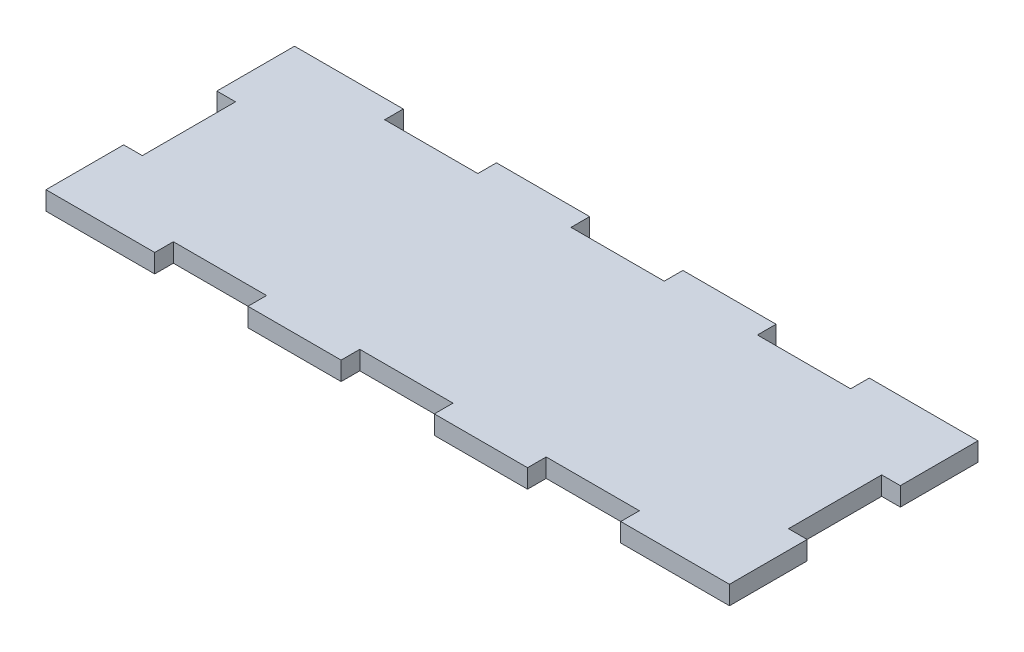
ISO-10303-21;
HEADER;
FILE_DESCRIPTION(('STEP AP214'),'2;1');
FILE_NAME('part.step','',(''),(''),'','','');
FILE_SCHEMA(('AUTOMOTIVE_DESIGN { 1 0 10303 214 1 1 1 1 }'));
ENDSEC;
DATA;
#1=APPLICATION_CONTEXT('core data for automotive mechanical design processes');
#2=APPLICATION_PROTOCOL_DEFINITION('international standard','automotive_design',2000,#1);
#3=PRODUCT_CONTEXT('',#1,'mechanical');
#4=PRODUCT('Part','Part','',(#3));
#5=PRODUCT_RELATED_PRODUCT_CATEGORY('part','',(#4));
#6=PRODUCT_DEFINITION_FORMATION('','',#4);
#7=PRODUCT_DEFINITION_CONTEXT('part definition',#1,'design');
#8=PRODUCT_DEFINITION('design','',#6,#7);
#9=PRODUCT_DEFINITION_SHAPE('','',#8);
#10=(LENGTH_UNIT() NAMED_UNIT(*) SI_UNIT(.MILLI.,.METRE.));
#11=(NAMED_UNIT(*) PLANE_ANGLE_UNIT() SI_UNIT($,.RADIAN.));
#12=(NAMED_UNIT(*) SI_UNIT($,.STERADIAN.) SOLID_ANGLE_UNIT());
#13=UNCERTAINTY_MEASURE_WITH_UNIT(LENGTH_MEASURE(1.E-05),#10,'distance_accuracy_value','');
#14=(GEOMETRIC_REPRESENTATION_CONTEXT(3) GLOBAL_UNCERTAINTY_ASSIGNED_CONTEXT((#13)) GLOBAL_UNIT_ASSIGNED_CONTEXT((#10,
#11,#12)) REPRESENTATION_CONTEXT('',''));
#15=CARTESIAN_POINT('',(0.,0.,0.));
#16=DIRECTION('',(0.,0.,1.));
#17=DIRECTION('',(1.,0.,0.));
#18=AXIS2_PLACEMENT_3D('',#15,#16,#17);
#19=CARTESIAN_POINT('',(3.,3.,0.));
#20=DIRECTION('',(-1.,0.,0.));
#21=DIRECTION('',(0.,0.,1.));
#22=AXIS2_PLACEMENT_3D('',#19,#20,#21);
#23=PLANE('',#22);
#24=DIRECTION('',(0.,0.,-1.));
#25=VECTOR('',#24,1.);
#26=CARTESIAN_POINT('',(3.,0.,0.));
#27=LINE('',#26,#25);
#28=CARTESIAN_POINT('',(3.,0.,-12.5));
#29=VERTEX_POINT('',#28);
#30=CARTESIAN_POINT('',(3.,0.,-27.5));
#31=VERTEX_POINT('',#30);
#32=EDGE_CURVE('E295',#29,#31,#27,.T.);
#33=ORIENTED_EDGE('',*,*,#32,.F.);
#34=DIRECTION('',(0.,-1.,0.));
#35=VECTOR('',#34,1.);
#36=CARTESIAN_POINT('',(3.,3.,-12.5));
#37=LINE('',#36,#35);
#38=CARTESIAN_POINT('',(3.,3.,-12.5));
#39=VERTEX_POINT('',#38);
#40=EDGE_CURVE('E11',#39,#29,#37,.T.);
#41=ORIENTED_EDGE('',*,*,#40,.F.);
#42=DIRECTION('',(0.,0.,-1.));
#43=VECTOR('',#42,1.);
#44=CARTESIAN_POINT('',(3.,3.,0.));
#45=LINE('',#44,#43);
#46=CARTESIAN_POINT('',(3.,3.,-27.5));
#47=VERTEX_POINT('',#46);
#48=EDGE_CURVE('E382',#39,#47,#45,.T.);
#49=ORIENTED_EDGE('',*,*,#48,.T.);
#50=DIRECTION('',(0.,-1.,0.));
#51=VECTOR('',#50,1.);
#52=CARTESIAN_POINT('',(3.,3.,-27.5));
#53=LINE('',#52,#51);
#54=EDGE_CURVE('E49',#47,#31,#53,.T.);
#55=ORIENTED_EDGE('',*,*,#54,.T.);
#56=EDGE_LOOP('',(#33,#41,#49,#55));
#57=FACE_BOUND('',#56,.T.);
#58=ADVANCED_FACE('F33',(#57),#23,.T.);
#59=CARTESIAN_POINT('',(0.,3.,-12.5));
#60=DIRECTION('',(0.,0.,1.));
#61=DIRECTION('',(1.,0.,0.));
#62=AXIS2_PLACEMENT_3D('',#59,#60,#61);
#63=PLANE('',#62);
#64=DIRECTION('',(-1.,0.,0.));
#65=VECTOR('',#64,1.);
#66=CARTESIAN_POINT('',(0.,0.,-12.5));
#67=LINE('',#66,#65);
#68=CARTESIAN_POINT('',(0.,0.,-12.5));
#69=VERTEX_POINT('',#68);
#70=EDGE_CURVE('E297',#29,#69,#67,.T.);
#71=ORIENTED_EDGE('',*,*,#70,.T.);
#72=DIRECTION('',(0.,-1.,0.));
#73=VECTOR('',#72,1.);
#74=CARTESIAN_POINT('',(0.,3.,-12.5));
#75=LINE('',#74,#73);
#76=CARTESIAN_POINT('',(0.,3.,-12.5));
#77=VERTEX_POINT('',#76);
#78=EDGE_CURVE('E41',#77,#69,#75,.T.);
#79=ORIENTED_EDGE('',*,*,#78,.F.);
#80=DIRECTION('',(-1.,0.,0.));
#81=VECTOR('',#80,1.);
#82=CARTESIAN_POINT('',(0.,3.,-12.5));
#83=LINE('',#82,#81);
#84=EDGE_CURVE('E485',#39,#77,#83,.T.);
#85=ORIENTED_EDGE('',*,*,#84,.F.);
#86=ORIENTED_EDGE('',*,*,#40,.T.);
#87=EDGE_LOOP('',(#71,#79,#85,#86));
#88=FACE_BOUND('',#87,.T.);
#89=ADVANCED_FACE('F571',(#88),#63,.F.);
#90=CARTESIAN_POINT('',(0.,3.,0.));
#91=DIRECTION('',(1.,0.,0.));
#92=DIRECTION('',(0.,0.,-1.));
#93=AXIS2_PLACEMENT_3D('',#90,#91,#92);
#94=PLANE('',#93);
#95=DIRECTION('',(0.,0.,1.));
#96=VECTOR('',#95,1.);
#97=CARTESIAN_POINT('',(0.,0.,0.));
#98=LINE('',#97,#96);
#99=CARTESIAN_POINT('',(0.,0.,0.));
#100=VERTEX_POINT('',#99);
#101=EDGE_CURVE('E299',#69,#100,#98,.T.);
#102=ORIENTED_EDGE('',*,*,#101,.T.);
#103=DIRECTION('',(0.,-1.,0.));
#104=VECTOR('',#103,1.);
#105=CARTESIAN_POINT('',(0.,3.,0.));
#106=LINE('',#105,#104);
#107=CARTESIAN_POINT('',(0.,3.,0.));
#108=VERTEX_POINT('',#107);
#109=EDGE_CURVE('E458',#108,#100,#106,.T.);
#110=ORIENTED_EDGE('',*,*,#109,.F.);
#111=DIRECTION('',(0.,0.,1.));
#112=VECTOR('',#111,1.);
#113=CARTESIAN_POINT('',(0.,3.,0.));
#114=LINE('',#113,#112);
#115=EDGE_CURVE('E467',#77,#108,#114,.T.);
#116=ORIENTED_EDGE('',*,*,#115,.F.);
#117=ORIENTED_EDGE('',*,*,#78,.T.);
#118=EDGE_LOOP('',(#102,#110,#116,#117));
#119=FACE_BOUND('',#118,.T.);
#120=ADVANCED_FACE('F465',(#119),#94,.F.);
#121=CARTESIAN_POINT('',(0.,3.,0.));
#122=DIRECTION('',(0.,0.,-1.));
#123=DIRECTION('',(-1.,0.,0.));
#124=AXIS2_PLACEMENT_3D('',#121,#122,#123);
#125=PLANE('',#124);
#126=DIRECTION('',(1.,0.,0.));
#127=VECTOR('',#126,1.);
#128=CARTESIAN_POINT('',(0.,0.,0.));
#129=LINE('',#128,#127);
#130=CARTESIAN_POINT('',(17.5,0.,0.));
#131=VERTEX_POINT('',#130);
#132=EDGE_CURVE('E301',#100,#131,#129,.T.);
#133=ORIENTED_EDGE('',*,*,#132,.T.);
#134=DIRECTION('',(0.,-1.,0.));
#135=VECTOR('',#134,1.);
#136=CARTESIAN_POINT('',(17.5,3.,0.));
#137=LINE('',#136,#135);
#138=CARTESIAN_POINT('',(17.5,3.,0.));
#139=VERTEX_POINT('',#138);
#140=EDGE_CURVE('E456',#139,#131,#137,.T.);
#141=ORIENTED_EDGE('',*,*,#140,.F.);
#142=DIRECTION('',(1.,0.,0.));
#143=VECTOR('',#142,1.);
#144=CARTESIAN_POINT('',(0.,3.,0.));
#145=LINE('',#144,#143);
#146=EDGE_CURVE('E479',#108,#139,#145,.T.);
#147=ORIENTED_EDGE('',*,*,#146,.F.);
#148=ORIENTED_EDGE('',*,*,#109,.T.);
#149=EDGE_LOOP('',(#133,#141,#147,#148));
#150=FACE_BOUND('',#149,.T.);
#151=ADVANCED_FACE('F476',(#150),#125,.F.);
#152=CARTESIAN_POINT('',(17.5,3.,0.));
#153=DIRECTION('',(1.,0.,0.));
#154=DIRECTION('',(0.,0.,-1.));
#155=AXIS2_PLACEMENT_3D('',#152,#153,#154);
#156=PLANE('',#155);
#157=DIRECTION('',(0.,0.,1.));
#158=VECTOR('',#157,1.);
#159=CARTESIAN_POINT('',(17.5,0.,0.));
#160=LINE('',#159,#158);
#161=CARTESIAN_POINT('',(17.5,0.,-3.));
#162=VERTEX_POINT('',#161);
#163=EDGE_CURVE('E304',#162,#131,#160,.T.);
#164=ORIENTED_EDGE('',*,*,#163,.F.);
#165=DIRECTION('',(0.,-1.,0.));
#166=VECTOR('',#165,1.);
#167=CARTESIAN_POINT('',(17.5,3.,-3.));
#168=LINE('',#167,#166);
#169=CARTESIAN_POINT('',(17.5,3.,-3.));
#170=VERTEX_POINT('',#169);
#171=EDGE_CURVE('E454',#170,#162,#168,.T.);
#172=ORIENTED_EDGE('',*,*,#171,.F.);
#173=DIRECTION('',(0.,0.,1.));
#174=VECTOR('',#173,1.);
#175=CARTESIAN_POINT('',(17.5,3.,0.));
#176=LINE('',#175,#174);
#177=EDGE_CURVE('E481',#170,#139,#176,.T.);
#178=ORIENTED_EDGE('',*,*,#177,.T.);
#179=ORIENTED_EDGE('',*,*,#140,.T.);
#180=EDGE_LOOP('',(#164,#172,#178,#179));
#181=FACE_BOUND('',#180,.T.);
#182=ADVANCED_FACE('F582',(#181),#156,.T.);
#183=CARTESIAN_POINT('',(0.,3.,-3.));
#184=DIRECTION('',(0.,0.,1.));
#185=DIRECTION('',(1.,0.,0.));
#186=AXIS2_PLACEMENT_3D('',#183,#184,#185);
#187=PLANE('',#186);
#188=DIRECTION('',(-1.,0.,0.));
#189=VECTOR('',#188,1.);
#190=CARTESIAN_POINT('',(0.,0.,-3.));
#191=LINE('',#190,#189);
#192=CARTESIAN_POINT('',(32.5,0.,-3.));
#193=VERTEX_POINT('',#192);
#194=EDGE_CURVE('E307',#193,#162,#191,.T.);
#195=ORIENTED_EDGE('',*,*,#194,.F.);
#196=DIRECTION('',(0.,-1.,0.));
#197=VECTOR('',#196,1.);
#198=CARTESIAN_POINT('',(32.5,3.,-3.));
#199=LINE('',#198,#197);
#200=CARTESIAN_POINT('',(32.5,3.,-3.));
#201=VERTEX_POINT('',#200);
#202=EDGE_CURVE('E452',#201,#193,#199,.T.);
#203=ORIENTED_EDGE('',*,*,#202,.F.);
#204=DIRECTION('',(-1.,0.,0.));
#205=VECTOR('',#204,1.);
#206=CARTESIAN_POINT('',(0.,3.,-3.));
#207=LINE('',#206,#205);
#208=EDGE_CURVE('E483',#201,#170,#207,.T.);
#209=ORIENTED_EDGE('',*,*,#208,.T.);
#210=ORIENTED_EDGE('',*,*,#171,.T.);
#211=EDGE_LOOP('',(#195,#203,#209,#210));
#212=FACE_BOUND('',#211,.T.);
#213=ADVANCED_FACE('F585',(#212),#187,.T.);
#214=CARTESIAN_POINT('',(32.5,3.,0.));
#215=DIRECTION('',(-1.,0.,0.));
#216=DIRECTION('',(0.,0.,1.));
#217=AXIS2_PLACEMENT_3D('',#214,#215,#216);
#218=PLANE('',#217);
#219=DIRECTION('',(0.,0.,-1.));
#220=VECTOR('',#219,1.);
#221=CARTESIAN_POINT('',(32.5,0.,0.));
#222=LINE('',#221,#220);
#223=CARTESIAN_POINT('',(32.5,0.,0.));
#224=VERTEX_POINT('',#223);
#225=EDGE_CURVE('E310',#224,#193,#222,.T.);
#226=ORIENTED_EDGE('',*,*,#225,.F.);
#227=DIRECTION('',(0.,-1.,0.));
#228=VECTOR('',#227,1.);
#229=CARTESIAN_POINT('',(32.5,3.,0.));
#230=LINE('',#229,#228);
#231=CARTESIAN_POINT('',(32.5,3.,0.));
#232=VERTEX_POINT('',#231);
#233=EDGE_CURVE('E450',#232,#224,#230,.T.);
#234=ORIENTED_EDGE('',*,*,#233,.F.);
#235=DIRECTION('',(0.,0.,-1.));
#236=VECTOR('',#235,1.);
#237=CARTESIAN_POINT('',(32.5,3.,0.));
#238=LINE('',#237,#236);
#239=EDGE_CURVE('E491',#232,#201,#238,.T.);
#240=ORIENTED_EDGE('',*,*,#239,.T.);
#241=ORIENTED_EDGE('',*,*,#202,.T.);
#242=EDGE_LOOP('',(#226,#234,#240,#241));
#243=FACE_BOUND('',#242,.T.);
#244=ADVANCED_FACE('F589',(#243),#218,.T.);
#245=CARTESIAN_POINT('',(0.,3.,0.));
#246=DIRECTION('',(0.,0.,-1.));
#247=DIRECTION('',(-1.,0.,0.));
#248=AXIS2_PLACEMENT_3D('',#245,#246,#247);
#249=PLANE('',#248);
#250=DIRECTION('',(1.,0.,0.));
#251=VECTOR('',#250,1.);
#252=CARTESIAN_POINT('',(0.,0.,0.));
#253=LINE('',#252,#251);
#254=CARTESIAN_POINT('',(47.5,0.,0.));
#255=VERTEX_POINT('',#254);
#256=EDGE_CURVE('E313',#224,#255,#253,.T.);
#257=ORIENTED_EDGE('',*,*,#256,.T.);
#258=DIRECTION('',(0.,-1.,0.));
#259=VECTOR('',#258,1.);
#260=CARTESIAN_POINT('',(47.5,3.,0.));
#261=LINE('',#260,#259);
#262=CARTESIAN_POINT('',(47.5,3.,0.));
#263=VERTEX_POINT('',#262);
#264=EDGE_CURVE('E448',#263,#255,#261,.T.);
#265=ORIENTED_EDGE('',*,*,#264,.F.);
#266=DIRECTION('',(1.,0.,0.));
#267=VECTOR('',#266,1.);
#268=CARTESIAN_POINT('',(0.,3.,0.));
#269=LINE('',#268,#267);
#270=EDGE_CURVE('E494',#232,#263,#269,.T.);
#271=ORIENTED_EDGE('',*,*,#270,.F.);
#272=ORIENTED_EDGE('',*,*,#233,.T.);
#273=EDGE_LOOP('',(#257,#265,#271,#272));
#274=FACE_BOUND('',#273,.T.);
#275=ADVANCED_FACE('F593',(#274),#249,.F.);
#276=CARTESIAN_POINT('',(47.5,3.,0.));
#277=DIRECTION('',(1.,0.,0.));
#278=DIRECTION('',(0.,0.,-1.));
#279=AXIS2_PLACEMENT_3D('',#276,#277,#278);
#280=PLANE('',#279);
#281=DIRECTION('',(0.,0.,1.));
#282=VECTOR('',#281,1.);
#283=CARTESIAN_POINT('',(47.5,0.,0.));
#284=LINE('',#283,#282);
#285=CARTESIAN_POINT('',(47.5,0.,-3.));
#286=VERTEX_POINT('',#285);
#287=EDGE_CURVE('E316',#286,#255,#284,.T.);
#288=ORIENTED_EDGE('',*,*,#287,.F.);
#289=DIRECTION('',(0.,-1.,0.));
#290=VECTOR('',#289,1.);
#291=CARTESIAN_POINT('',(47.5,3.,-3.));
#292=LINE('',#291,#290);
#293=CARTESIAN_POINT('',(47.5,3.,-3.));
#294=VERTEX_POINT('',#293);
#295=EDGE_CURVE('E446',#294,#286,#292,.T.);
#296=ORIENTED_EDGE('',*,*,#295,.F.);
#297=DIRECTION('',(0.,0.,1.));
#298=VECTOR('',#297,1.);
#299=CARTESIAN_POINT('',(47.5,3.,0.));
#300=LINE('',#299,#298);
#301=EDGE_CURVE('E496',#294,#263,#300,.T.);
#302=ORIENTED_EDGE('',*,*,#301,.T.);
#303=ORIENTED_EDGE('',*,*,#264,.T.);
#304=EDGE_LOOP('',(#288,#296,#302,#303));
#305=FACE_BOUND('',#304,.T.);
#306=ADVANCED_FACE('F597',(#305),#280,.T.);
#307=CARTESIAN_POINT('',(0.,3.,-3.));
#308=DIRECTION('',(0.,0.,-1.));
#309=DIRECTION('',(-1.,0.,0.));
#310=AXIS2_PLACEMENT_3D('',#307,#308,#309);
#311=PLANE('',#310);
#312=DIRECTION('',(1.,0.,0.));
#313=VECTOR('',#312,1.);
#314=CARTESIAN_POINT('',(0.,0.,-3.));
#315=LINE('',#314,#313);
#316=CARTESIAN_POINT('',(62.5,0.,-3.));
#317=VERTEX_POINT('',#316);
#318=EDGE_CURVE('E319',#286,#317,#315,.T.);
#319=ORIENTED_EDGE('',*,*,#318,.T.);
#320=DIRECTION('',(0.,-1.,0.));
#321=VECTOR('',#320,1.);
#322=CARTESIAN_POINT('',(62.5,3.,-3.));
#323=LINE('',#322,#321);
#324=CARTESIAN_POINT('',(62.5,3.,-3.));
#325=VERTEX_POINT('',#324);
#326=EDGE_CURVE('E443',#325,#317,#323,.T.);
#327=ORIENTED_EDGE('',*,*,#326,.F.);
#328=DIRECTION('',(1.,0.,0.));
#329=VECTOR('',#328,1.);
#330=CARTESIAN_POINT('',(0.,3.,-3.));
#331=LINE('',#330,#329);
#332=EDGE_CURVE('E499',#294,#325,#331,.T.);
#333=ORIENTED_EDGE('',*,*,#332,.F.);
#334=ORIENTED_EDGE('',*,*,#295,.T.);
#335=EDGE_LOOP('',(#319,#327,#333,#334));
#336=FACE_BOUND('',#335,.T.);
#337=ADVANCED_FACE('F601',(#336),#311,.F.);
#338=CARTESIAN_POINT('',(62.5,3.,0.));
#339=DIRECTION('',(1.,0.,0.));
#340=DIRECTION('',(0.,0.,-1.));
#341=AXIS2_PLACEMENT_3D('',#338,#339,#340);
#342=PLANE('',#341);
#343=DIRECTION('',(0.,0.,1.));
#344=VECTOR('',#343,1.);
#345=CARTESIAN_POINT('',(62.5,0.,0.));
#346=LINE('',#345,#344);
#347=CARTESIAN_POINT('',(62.5,0.,0.));
#348=VERTEX_POINT('',#347);
#349=EDGE_CURVE('E321',#317,#348,#346,.T.);
#350=ORIENTED_EDGE('',*,*,#349,.T.);
#351=DIRECTION('',(0.,-1.,0.));
#352=VECTOR('',#351,1.);
#353=CARTESIAN_POINT('',(62.5,3.,0.));
#354=LINE('',#353,#352);
#355=CARTESIAN_POINT('',(62.5,3.,0.));
#356=VERTEX_POINT('',#355);
#357=EDGE_CURVE('E440',#356,#348,#354,.T.);
#358=ORIENTED_EDGE('',*,*,#357,.F.);
#359=DIRECTION('',(0.,0.,1.));
#360=VECTOR('',#359,1.);
#361=CARTESIAN_POINT('',(62.5,3.,0.));
#362=LINE('',#361,#360);
#363=EDGE_CURVE('E501',#325,#356,#362,.T.);
#364=ORIENTED_EDGE('',*,*,#363,.F.);
#365=ORIENTED_EDGE('',*,*,#326,.T.);
#366=EDGE_LOOP('',(#350,#358,#364,#365));
#367=FACE_BOUND('',#366,.T.);
#368=ADVANCED_FACE('F605',(#367),#342,.F.);
#369=CARTESIAN_POINT('',(0.,3.,0.));
#370=DIRECTION('',(0.,0.,-1.));
#371=DIRECTION('',(-1.,0.,0.));
#372=AXIS2_PLACEMENT_3D('',#369,#370,#371);
#373=PLANE('',#372);
#374=DIRECTION('',(1.,0.,0.));
#375=VECTOR('',#374,1.);
#376=CARTESIAN_POINT('',(0.,0.,0.));
#377=LINE('',#376,#375);
#378=CARTESIAN_POINT('',(77.5,0.,0.));
#379=VERTEX_POINT('',#378);
#380=EDGE_CURVE('E323',#348,#379,#377,.T.);
#381=ORIENTED_EDGE('',*,*,#380,.T.);
#382=DIRECTION('',(0.,-1.,0.));
#383=VECTOR('',#382,1.);
#384=CARTESIAN_POINT('',(77.5,3.,0.));
#385=LINE('',#384,#383);
#386=CARTESIAN_POINT('',(77.5,3.,0.));
#387=VERTEX_POINT('',#386);
#388=EDGE_CURVE('E437',#387,#379,#385,.T.);
#389=ORIENTED_EDGE('',*,*,#388,.F.);
#390=DIRECTION('',(1.,0.,0.));
#391=VECTOR('',#390,1.);
#392=CARTESIAN_POINT('',(0.,3.,0.));
#393=LINE('',#392,#391);
#394=EDGE_CURVE('E503',#356,#387,#393,.T.);
#395=ORIENTED_EDGE('',*,*,#394,.F.);
#396=ORIENTED_EDGE('',*,*,#357,.T.);
#397=EDGE_LOOP('',(#381,#389,#395,#396));
#398=FACE_BOUND('',#397,.T.);
#399=ADVANCED_FACE('F609',(#398),#373,.F.);
#400=CARTESIAN_POINT('',(77.5,3.,0.));
#401=DIRECTION('',(-1.,0.,0.));
#402=DIRECTION('',(0.,0.,1.));
#403=AXIS2_PLACEMENT_3D('',#400,#401,#402);
#404=PLANE('',#403);
#405=DIRECTION('',(0.,0.,-1.));
#406=VECTOR('',#405,1.);
#407=CARTESIAN_POINT('',(77.5,0.,0.));
#408=LINE('',#407,#406);
#409=CARTESIAN_POINT('',(77.5,0.,-3.));
#410=VERTEX_POINT('',#409);
#411=EDGE_CURVE('E325',#379,#410,#408,.T.);
#412=ORIENTED_EDGE('',*,*,#411,.T.);
#413=DIRECTION('',(0.,-1.,0.));
#414=VECTOR('',#413,1.);
#415=CARTESIAN_POINT('',(77.5,3.,-3.));
#416=LINE('',#415,#414);
#417=CARTESIAN_POINT('',(77.5,3.,-3.));
#418=VERTEX_POINT('',#417);
#419=EDGE_CURVE('E434',#418,#410,#416,.T.);
#420=ORIENTED_EDGE('',*,*,#419,.F.);
#421=DIRECTION('',(0.,0.,-1.));
#422=VECTOR('',#421,1.);
#423=CARTESIAN_POINT('',(77.5,3.,0.));
#424=LINE('',#423,#422);
#425=EDGE_CURVE('E505',#387,#418,#424,.T.);
#426=ORIENTED_EDGE('',*,*,#425,.F.);
#427=ORIENTED_EDGE('',*,*,#388,.T.);
#428=EDGE_LOOP('',(#412,#420,#426,#427));
#429=FACE_BOUND('',#428,.T.);
#430=ADVANCED_FACE('F613',(#429),#404,.F.);
#431=CARTESIAN_POINT('',(0.,3.,-3.));
#432=DIRECTION('',(0.,0.,-1.));
#433=DIRECTION('',(-1.,0.,0.));
#434=AXIS2_PLACEMENT_3D('',#431,#432,#433);
#435=PLANE('',#434);
#436=DIRECTION('',(1.,0.,0.));
#437=VECTOR('',#436,1.);
#438=CARTESIAN_POINT('',(0.,0.,-3.));
#439=LINE('',#438,#437);
#440=CARTESIAN_POINT('',(92.5,0.,-3.));
#441=VERTEX_POINT('',#440);
#442=EDGE_CURVE('E327',#410,#441,#439,.T.);
#443=ORIENTED_EDGE('',*,*,#442,.T.);
#444=DIRECTION('',(0.,-1.,0.));
#445=VECTOR('',#444,1.);
#446=CARTESIAN_POINT('',(92.5,3.,-3.));
#447=LINE('',#446,#445);
#448=CARTESIAN_POINT('',(92.5,3.,-3.));
#449=VERTEX_POINT('',#448);
#450=EDGE_CURVE('E431',#449,#441,#447,.T.);
#451=ORIENTED_EDGE('',*,*,#450,.F.);
#452=DIRECTION('',(1.,0.,0.));
#453=VECTOR('',#452,1.);
#454=CARTESIAN_POINT('',(0.,3.,-3.));
#455=LINE('',#454,#453);
#456=EDGE_CURVE('E507',#418,#449,#455,.T.);
#457=ORIENTED_EDGE('',*,*,#456,.F.);
#458=ORIENTED_EDGE('',*,*,#419,.T.);
#459=EDGE_LOOP('',(#443,#451,#457,#458));
#460=FACE_BOUND('',#459,.T.);
#461=ADVANCED_FACE('F617',(#460),#435,.F.);
#462=CARTESIAN_POINT('',(92.5,3.,0.));
#463=DIRECTION('',(1.,0.,0.));
#464=DIRECTION('',(0.,0.,-1.));
#465=AXIS2_PLACEMENT_3D('',#462,#463,#464);
#466=PLANE('',#465);
#467=DIRECTION('',(0.,0.,1.));
#468=VECTOR('',#467,1.);
#469=CARTESIAN_POINT('',(92.5,0.,0.));
#470=LINE('',#469,#468);
#471=CARTESIAN_POINT('',(92.5,0.,0.));
#472=VERTEX_POINT('',#471);
#473=EDGE_CURVE('E329',#441,#472,#470,.T.);
#474=ORIENTED_EDGE('',*,*,#473,.T.);
#475=DIRECTION('',(0.,-1.,0.));
#476=VECTOR('',#475,1.);
#477=CARTESIAN_POINT('',(92.5,3.,0.));
#478=LINE('',#477,#476);
#479=CARTESIAN_POINT('',(92.5,3.,0.));
#480=VERTEX_POINT('',#479);
#481=EDGE_CURVE('E428',#480,#472,#478,.T.);
#482=ORIENTED_EDGE('',*,*,#481,.F.);
#483=DIRECTION('',(0.,0.,1.));
#484=VECTOR('',#483,1.);
#485=CARTESIAN_POINT('',(92.5,3.,0.));
#486=LINE('',#485,#484);
#487=EDGE_CURVE('E509',#449,#480,#486,.T.);
#488=ORIENTED_EDGE('',*,*,#487,.F.);
#489=ORIENTED_EDGE('',*,*,#450,.T.);
#490=EDGE_LOOP('',(#474,#482,#488,#489));
#491=FACE_BOUND('',#490,.T.);
#492=ADVANCED_FACE('F621',(#491),#466,.F.);
#493=CARTESIAN_POINT('',(0.,3.,0.));
#494=DIRECTION('',(0.,0.,-1.));
#495=DIRECTION('',(-1.,0.,0.));
#496=AXIS2_PLACEMENT_3D('',#493,#494,#495);
#497=PLANE('',#496);
#498=DIRECTION('',(1.,0.,0.));
#499=VECTOR('',#498,1.);
#500=CARTESIAN_POINT('',(0.,0.,0.));
#501=LINE('',#500,#499);
#502=CARTESIAN_POINT('',(110.,0.,0.));
#503=VERTEX_POINT('',#502);
#504=EDGE_CURVE('E331',#472,#503,#501,.T.);
#505=ORIENTED_EDGE('',*,*,#504,.T.);
#506=DIRECTION('',(0.,-1.,0.));
#507=VECTOR('',#506,1.);
#508=CARTESIAN_POINT('',(110.,3.,0.));
#509=LINE('',#508,#507);
#510=CARTESIAN_POINT('',(110.,3.,0.));
#511=VERTEX_POINT('',#510);
#512=EDGE_CURVE('E425',#511,#503,#509,.T.);
#513=ORIENTED_EDGE('',*,*,#512,.F.);
#514=DIRECTION('',(1.,0.,0.));
#515=VECTOR('',#514,1.);
#516=CARTESIAN_POINT('',(0.,3.,0.));
#517=LINE('',#516,#515);
#518=EDGE_CURVE('E511',#480,#511,#517,.T.);
#519=ORIENTED_EDGE('',*,*,#518,.F.);
#520=ORIENTED_EDGE('',*,*,#481,.T.);
#521=EDGE_LOOP('',(#505,#513,#519,#520));
#522=FACE_BOUND('',#521,.T.);
#523=ADVANCED_FACE('F625',(#522),#497,.F.);
#524=CARTESIAN_POINT('',(110.,3.,0.));
#525=DIRECTION('',(-1.,0.,0.));
#526=DIRECTION('',(0.,0.,1.));
#527=AXIS2_PLACEMENT_3D('',#524,#525,#526);
#528=PLANE('',#527);
#529=DIRECTION('',(0.,0.,-1.));
#530=VECTOR('',#529,1.);
#531=CARTESIAN_POINT('',(110.,0.,0.));
#532=LINE('',#531,#530);
#533=CARTESIAN_POINT('',(110.,0.,-12.5));
#534=VERTEX_POINT('',#533);
#535=EDGE_CURVE('E333',#503,#534,#532,.T.);
#536=ORIENTED_EDGE('',*,*,#535,.T.);
#537=DIRECTION('',(0.,-1.,0.));
#538=VECTOR('',#537,1.);
#539=CARTESIAN_POINT('',(110.,3.,-12.5));
#540=LINE('',#539,#538);
#541=CARTESIAN_POINT('',(110.,3.,-12.5));
#542=VERTEX_POINT('',#541);
#543=EDGE_CURVE('E423',#542,#534,#540,.T.);
#544=ORIENTED_EDGE('',*,*,#543,.F.);
#545=DIRECTION('',(0.,0.,-1.));
#546=VECTOR('',#545,1.);
#547=CARTESIAN_POINT('',(110.,3.,0.));
#548=LINE('',#547,#546);
#549=EDGE_CURVE('E513',#511,#542,#548,.T.);
#550=ORIENTED_EDGE('',*,*,#549,.F.);
#551=ORIENTED_EDGE('',*,*,#512,.T.);
#552=EDGE_LOOP('',(#536,#544,#550,#551));
#553=FACE_BOUND('',#552,.T.);
#554=ADVANCED_FACE('F629',(#553),#528,.F.);
#555=CARTESIAN_POINT('',(0.,3.,-12.5));
#556=DIRECTION('',(0.,0.,-1.));
#557=DIRECTION('',(-1.,0.,0.));
#558=AXIS2_PLACEMENT_3D('',#555,#556,#557);
#559=PLANE('',#558);
#560=DIRECTION('',(1.,0.,0.));
#561=VECTOR('',#560,1.);
#562=CARTESIAN_POINT('',(0.,0.,-12.5));
#563=LINE('',#562,#561);
#564=CARTESIAN_POINT('',(107.,0.,-12.5));
#565=VERTEX_POINT('',#564);
#566=EDGE_CURVE('E336',#565,#534,#563,.T.);
#567=ORIENTED_EDGE('',*,*,#566,.F.);
#568=DIRECTION('',(0.,-1.,0.));
#569=VECTOR('',#568,1.);
#570=CARTESIAN_POINT('',(107.,3.,-12.5));
#571=LINE('',#570,#569);
#572=CARTESIAN_POINT('',(107.,3.,-12.5));
#573=VERTEX_POINT('',#572);
#574=EDGE_CURVE('E421',#573,#565,#571,.T.);
#575=ORIENTED_EDGE('',*,*,#574,.F.);
#576=DIRECTION('',(1.,0.,0.));
#577=VECTOR('',#576,1.);
#578=CARTESIAN_POINT('',(0.,3.,-12.5));
#579=LINE('',#578,#577);
#580=EDGE_CURVE('E515',#573,#542,#579,.T.);
#581=ORIENTED_EDGE('',*,*,#580,.T.);
#582=ORIENTED_EDGE('',*,*,#543,.T.);
#583=EDGE_LOOP('',(#567,#575,#581,#582));
#584=FACE_BOUND('',#583,.T.);
#585=ADVANCED_FACE('F633',(#584),#559,.T.);
#586=CARTESIAN_POINT('',(107.,3.,0.));
#587=DIRECTION('',(-1.,0.,0.));
#588=DIRECTION('',(0.,0.,1.));
#589=AXIS2_PLACEMENT_3D('',#586,#587,#588);
#590=PLANE('',#589);
#591=DIRECTION('',(0.,0.,-1.));
#592=VECTOR('',#591,1.);
#593=CARTESIAN_POINT('',(107.,0.,0.));
#594=LINE('',#593,#592);
#595=CARTESIAN_POINT('',(107.,0.,-27.5));
#596=VERTEX_POINT('',#595);
#597=EDGE_CURVE('E339',#565,#596,#594,.T.);
#598=ORIENTED_EDGE('',*,*,#597,.T.);
#599=DIRECTION('',(0.,-1.,0.));
#600=VECTOR('',#599,1.);
#601=CARTESIAN_POINT('',(107.,3.,-27.5));
#602=LINE('',#601,#600);
#603=CARTESIAN_POINT('',(107.,3.,-27.5));
#604=VERTEX_POINT('',#603);
#605=EDGE_CURVE('E418',#604,#596,#602,.T.);
#606=ORIENTED_EDGE('',*,*,#605,.F.);
#607=DIRECTION('',(0.,0.,-1.));
#608=VECTOR('',#607,1.);
#609=CARTESIAN_POINT('',(107.,3.,0.));
#610=LINE('',#609,#608);
#611=EDGE_CURVE('E518',#573,#604,#610,.T.);
#612=ORIENTED_EDGE('',*,*,#611,.F.);
#613=ORIENTED_EDGE('',*,*,#574,.T.);
#614=EDGE_LOOP('',(#598,#606,#612,#613));
#615=FACE_BOUND('',#614,.T.);
#616=ADVANCED_FACE('F637',(#615),#590,.F.);
#617=CARTESIAN_POINT('',(0.,3.,-27.5));
#618=DIRECTION('',(0.,0.,-1.));
#619=DIRECTION('',(-1.,0.,0.));
#620=AXIS2_PLACEMENT_3D('',#617,#618,#619);
#621=PLANE('',#620);
#622=DIRECTION('',(1.,0.,0.));
#623=VECTOR('',#622,1.);
#624=CARTESIAN_POINT('',(0.,0.,-27.5));
#625=LINE('',#624,#623);
#626=CARTESIAN_POINT('',(110.,0.,-27.5));
#627=VERTEX_POINT('',#626);
#628=EDGE_CURVE('E341',#596,#627,#625,.T.);
#629=ORIENTED_EDGE('',*,*,#628,.T.);
#630=DIRECTION('',(0.,-1.,0.));
#631=VECTOR('',#630,1.);
#632=CARTESIAN_POINT('',(110.,3.,-27.5));
#633=LINE('',#632,#631);
#634=CARTESIAN_POINT('',(110.,3.,-27.5));
#635=VERTEX_POINT('',#634);
#636=EDGE_CURVE('E415',#635,#627,#633,.T.);
#637=ORIENTED_EDGE('',*,*,#636,.F.);
#638=DIRECTION('',(1.,0.,0.));
#639=VECTOR('',#638,1.);
#640=CARTESIAN_POINT('',(0.,3.,-27.5));
#641=LINE('',#640,#639);
#642=EDGE_CURVE('E520',#604,#635,#641,.T.);
#643=ORIENTED_EDGE('',*,*,#642,.F.);
#644=ORIENTED_EDGE('',*,*,#605,.T.);
#645=EDGE_LOOP('',(#629,#637,#643,#644));
#646=FACE_BOUND('',#645,.T.);
#647=ADVANCED_FACE('F641',(#646),#621,.F.);
#648=CARTESIAN_POINT('',(110.,3.,1.22124532708767E-13));
#649=DIRECTION('',(-1.,0.,0.));
#650=DIRECTION('',(0.,0.,1.));
#651=AXIS2_PLACEMENT_3D('',#648,#649,#650);
#652=PLANE('',#651);
#653=DIRECTION('',(0.,0.,-1.));
#654=VECTOR('',#653,1.);
#655=CARTESIAN_POINT('',(110.,0.,1.22124532708767E-13));
#656=LINE('',#655,#654);
#657=CARTESIAN_POINT('',(110.,0.,-40.));
#658=VERTEX_POINT('',#657);
#659=EDGE_CURVE('E343',#627,#658,#656,.T.);
#660=ORIENTED_EDGE('',*,*,#659,.T.);
#661=DIRECTION('',(0.,-1.,0.));
#662=VECTOR('',#661,1.);
#663=CARTESIAN_POINT('',(110.,3.,-40.));
#664=LINE('',#663,#662);
#665=CARTESIAN_POINT('',(110.,3.,-40.));
#666=VERTEX_POINT('',#665);
#667=EDGE_CURVE('E412',#666,#658,#664,.T.);
#668=ORIENTED_EDGE('',*,*,#667,.F.);
#669=DIRECTION('',(0.,0.,-1.));
#670=VECTOR('',#669,1.);
#671=CARTESIAN_POINT('',(110.,3.,1.22124532708767E-13));
#672=LINE('',#671,#670);
#673=EDGE_CURVE('E522',#635,#666,#672,.T.);
#674=ORIENTED_EDGE('',*,*,#673,.F.);
#675=ORIENTED_EDGE('',*,*,#636,.T.);
#676=EDGE_LOOP('',(#660,#668,#674,#675));
#677=FACE_BOUND('',#676,.T.);
#678=ADVANCED_FACE('F645',(#677),#652,.F.);
#679=CARTESIAN_POINT('',(0.,3.,-39.9999999999999));
#680=DIRECTION('',(0.,0.,1.));
#681=DIRECTION('',(1.,0.,0.));
#682=AXIS2_PLACEMENT_3D('',#679,#680,#681);
#683=PLANE('',#682);
#684=DIRECTION('',(-1.,0.,0.));
#685=VECTOR('',#684,1.);
#686=CARTESIAN_POINT('',(0.,0.,-39.9999999999999));
#687=LINE('',#686,#685);
#688=CARTESIAN_POINT('',(92.5,0.,-40.));
#689=VERTEX_POINT('',#688);
#690=EDGE_CURVE('E345',#658,#689,#687,.T.);
#691=ORIENTED_EDGE('',*,*,#690,.T.);
#692=DIRECTION('',(0.,-1.,0.));
#693=VECTOR('',#692,1.);
#694=CARTESIAN_POINT('',(92.5,3.,-40.));
#695=LINE('',#694,#693);
#696=CARTESIAN_POINT('',(92.5,3.,-40.));
#697=VERTEX_POINT('',#696);
#698=EDGE_CURVE('E410',#697,#689,#695,.T.);
#699=ORIENTED_EDGE('',*,*,#698,.F.);
#700=DIRECTION('',(-1.,0.,0.));
#701=VECTOR('',#700,1.);
#702=CARTESIAN_POINT('',(0.,3.,-39.9999999999999));
#703=LINE('',#702,#701);
#704=EDGE_CURVE('E524',#666,#697,#703,.T.);
#705=ORIENTED_EDGE('',*,*,#704,.F.);
#706=ORIENTED_EDGE('',*,*,#667,.T.);
#707=EDGE_LOOP('',(#691,#699,#705,#706));
#708=FACE_BOUND('',#707,.T.);
#709=ADVANCED_FACE('F649',(#708),#683,.F.);
#710=CARTESIAN_POINT('',(92.5,3.,0.));
#711=DIRECTION('',(-1.,0.,0.));
#712=DIRECTION('',(0.,0.,1.));
#713=AXIS2_PLACEMENT_3D('',#710,#711,#712);
#714=PLANE('',#713);
#715=DIRECTION('',(0.,0.,-1.));
#716=VECTOR('',#715,1.);
#717=CARTESIAN_POINT('',(92.5,0.,0.));
#718=LINE('',#717,#716);
#719=CARTESIAN_POINT('',(92.5,0.,-37.));
#720=VERTEX_POINT('',#719);
#721=EDGE_CURVE('E348',#720,#689,#718,.T.);
#722=ORIENTED_EDGE('',*,*,#721,.F.);
#723=DIRECTION('',(0.,-1.,0.));
#724=VECTOR('',#723,1.);
#725=CARTESIAN_POINT('',(92.5,3.,-37.));
#726=LINE('',#725,#724);
#727=CARTESIAN_POINT('',(92.5,3.,-37.));
#728=VERTEX_POINT('',#727);
#729=EDGE_CURVE('E408',#728,#720,#726,.T.);
#730=ORIENTED_EDGE('',*,*,#729,.F.);
#731=DIRECTION('',(0.,0.,-1.));
#732=VECTOR('',#731,1.);
#733=CARTESIAN_POINT('',(92.5,3.,0.));
#734=LINE('',#733,#732);
#735=EDGE_CURVE('E526',#728,#697,#734,.T.);
#736=ORIENTED_EDGE('',*,*,#735,.T.);
#737=ORIENTED_EDGE('',*,*,#698,.T.);
#738=EDGE_LOOP('',(#722,#730,#736,#737));
#739=FACE_BOUND('',#738,.T.);
#740=ADVANCED_FACE('F653',(#739),#714,.T.);
#741=CARTESIAN_POINT('',(0.,3.,-37.));
#742=DIRECTION('',(0.,0.,-1.));
#743=DIRECTION('',(-1.,0.,0.));
#744=AXIS2_PLACEMENT_3D('',#741,#742,#743);
#745=PLANE('',#744);
#746=DIRECTION('',(1.,0.,0.));
#747=VECTOR('',#746,1.);
#748=CARTESIAN_POINT('',(0.,0.,-37.));
#749=LINE('',#748,#747);
#750=CARTESIAN_POINT('',(77.5,0.,-37.));
#751=VERTEX_POINT('',#750);
#752=EDGE_CURVE('E351',#751,#720,#749,.T.);
#753=ORIENTED_EDGE('',*,*,#752,.F.);
#754=DIRECTION('',(0.,-1.,0.));
#755=VECTOR('',#754,1.);
#756=CARTESIAN_POINT('',(77.5,3.,-37.));
#757=LINE('',#756,#755);
#758=CARTESIAN_POINT('',(77.5,3.,-37.));
#759=VERTEX_POINT('',#758);
#760=EDGE_CURVE('E406',#759,#751,#757,.T.);
#761=ORIENTED_EDGE('',*,*,#760,.F.);
#762=DIRECTION('',(1.,0.,0.));
#763=VECTOR('',#762,1.);
#764=CARTESIAN_POINT('',(0.,3.,-37.));
#765=LINE('',#764,#763);
#766=EDGE_CURVE('E529',#759,#728,#765,.T.);
#767=ORIENTED_EDGE('',*,*,#766,.T.);
#768=ORIENTED_EDGE('',*,*,#729,.T.);
#769=EDGE_LOOP('',(#753,#761,#767,#768));
#770=FACE_BOUND('',#769,.T.);
#771=ADVANCED_FACE('F657',(#770),#745,.T.);
#772=CARTESIAN_POINT('',(77.5,3.,0.));
#773=DIRECTION('',(1.,0.,0.));
#774=DIRECTION('',(0.,0.,-1.));
#775=AXIS2_PLACEMENT_3D('',#772,#773,#774);
#776=PLANE('',#775);
#777=DIRECTION('',(0.,0.,1.));
#778=VECTOR('',#777,1.);
#779=CARTESIAN_POINT('',(77.5,0.,0.));
#780=LINE('',#779,#778);
#781=CARTESIAN_POINT('',(77.5,0.,-40.));
#782=VERTEX_POINT('',#781);
#783=EDGE_CURVE('E354',#782,#751,#780,.T.);
#784=ORIENTED_EDGE('',*,*,#783,.F.);
#785=DIRECTION('',(0.,-1.,0.));
#786=VECTOR('',#785,1.);
#787=CARTESIAN_POINT('',(77.5,3.,-40.));
#788=LINE('',#787,#786);
#789=CARTESIAN_POINT('',(77.5,3.,-40.));
#790=VERTEX_POINT('',#789);
#791=EDGE_CURVE('E404',#790,#782,#788,.T.);
#792=ORIENTED_EDGE('',*,*,#791,.F.);
#793=DIRECTION('',(0.,0.,1.));
#794=VECTOR('',#793,1.);
#795=CARTESIAN_POINT('',(77.5,3.,0.));
#796=LINE('',#795,#794);
#797=EDGE_CURVE('E532',#790,#759,#796,.T.);
#798=ORIENTED_EDGE('',*,*,#797,.T.);
#799=ORIENTED_EDGE('',*,*,#760,.T.);
#800=EDGE_LOOP('',(#784,#792,#798,#799));
#801=FACE_BOUND('',#800,.T.);
#802=ADVANCED_FACE('F661',(#801),#776,.T.);
#803=CARTESIAN_POINT('',(0.,3.,-40.));
#804=DIRECTION('',(0.,0.,1.));
#805=DIRECTION('',(1.,0.,0.));
#806=AXIS2_PLACEMENT_3D('',#803,#804,#805);
#807=PLANE('',#806);
#808=DIRECTION('',(-1.,0.,0.));
#809=VECTOR('',#808,1.);
#810=CARTESIAN_POINT('',(0.,0.,-40.));
#811=LINE('',#810,#809);
#812=CARTESIAN_POINT('',(62.5,0.,-40.));
#813=VERTEX_POINT('',#812);
#814=EDGE_CURVE('E357',#782,#813,#811,.T.);
#815=ORIENTED_EDGE('',*,*,#814,.T.);
#816=DIRECTION('',(0.,-1.,0.));
#817=VECTOR('',#816,1.);
#818=CARTESIAN_POINT('',(62.5,3.,-40.));
#819=LINE('',#818,#817);
#820=CARTESIAN_POINT('',(62.5,3.,-40.));
#821=VERTEX_POINT('',#820);
#822=EDGE_CURVE('E402',#821,#813,#819,.T.);
#823=ORIENTED_EDGE('',*,*,#822,.F.);
#824=DIRECTION('',(-1.,0.,0.));
#825=VECTOR('',#824,1.);
#826=CARTESIAN_POINT('',(0.,3.,-40.));
#827=LINE('',#826,#825);
#828=EDGE_CURVE('E535',#790,#821,#827,.T.);
#829=ORIENTED_EDGE('',*,*,#828,.F.);
#830=ORIENTED_EDGE('',*,*,#791,.T.);
#831=EDGE_LOOP('',(#815,#823,#829,#830));
#832=FACE_BOUND('',#831,.T.);
#833=ADVANCED_FACE('F665',(#832),#807,.F.);
#834=CARTESIAN_POINT('',(62.5,3.,0.));
#835=DIRECTION('',(-1.,0.,0.));
#836=DIRECTION('',(0.,0.,1.));
#837=AXIS2_PLACEMENT_3D('',#834,#835,#836);
#838=PLANE('',#837);
#839=DIRECTION('',(0.,0.,-1.));
#840=VECTOR('',#839,1.);
#841=CARTESIAN_POINT('',(62.5,0.,0.));
#842=LINE('',#841,#840);
#843=CARTESIAN_POINT('',(62.5,0.,-37.));
#844=VERTEX_POINT('',#843);
#845=EDGE_CURVE('E360',#844,#813,#842,.T.);
#846=ORIENTED_EDGE('',*,*,#845,.F.);
#847=DIRECTION('',(0.,-1.,0.));
#848=VECTOR('',#847,1.);
#849=CARTESIAN_POINT('',(62.5,3.,-37.));
#850=LINE('',#849,#848);
#851=CARTESIAN_POINT('',(62.5,3.,-37.));
#852=VERTEX_POINT('',#851);
#853=EDGE_CURVE('E400',#852,#844,#850,.T.);
#854=ORIENTED_EDGE('',*,*,#853,.F.);
#855=DIRECTION('',(0.,0.,-1.));
#856=VECTOR('',#855,1.);
#857=CARTESIAN_POINT('',(62.5,3.,0.));
#858=LINE('',#857,#856);
#859=EDGE_CURVE('E537',#852,#821,#858,.T.);
#860=ORIENTED_EDGE('',*,*,#859,.T.);
#861=ORIENTED_EDGE('',*,*,#822,.T.);
#862=EDGE_LOOP('',(#846,#854,#860,#861));
#863=FACE_BOUND('',#862,.T.);
#864=ADVANCED_FACE('F669',(#863),#838,.T.);
#865=CARTESIAN_POINT('',(0.,3.,-37.));
#866=DIRECTION('',(0.,0.,-1.));
#867=DIRECTION('',(-1.,0.,0.));
#868=AXIS2_PLACEMENT_3D('',#865,#866,#867);
#869=PLANE('',#868);
#870=DIRECTION('',(1.,0.,0.));
#871=VECTOR('',#870,1.);
#872=CARTESIAN_POINT('',(0.,0.,-37.));
#873=LINE('',#872,#871);
#874=CARTESIAN_POINT('',(47.5,0.,-37.));
#875=VERTEX_POINT('',#874);
#876=EDGE_CURVE('E363',#875,#844,#873,.T.);
#877=ORIENTED_EDGE('',*,*,#876,.F.);
#878=DIRECTION('',(0.,-1.,0.));
#879=VECTOR('',#878,1.);
#880=CARTESIAN_POINT('',(47.5,3.,-37.));
#881=LINE('',#880,#879);
#882=CARTESIAN_POINT('',(47.5,3.,-37.));
#883=VERTEX_POINT('',#882);
#884=EDGE_CURVE('E398',#883,#875,#881,.T.);
#885=ORIENTED_EDGE('',*,*,#884,.F.);
#886=DIRECTION('',(1.,0.,0.));
#887=VECTOR('',#886,1.);
#888=CARTESIAN_POINT('',(0.,3.,-37.));
#889=LINE('',#888,#887);
#890=EDGE_CURVE('E540',#883,#852,#889,.T.);
#891=ORIENTED_EDGE('',*,*,#890,.T.);
#892=ORIENTED_EDGE('',*,*,#853,.T.);
#893=EDGE_LOOP('',(#877,#885,#891,#892));
#894=FACE_BOUND('',#893,.T.);
#895=ADVANCED_FACE('F673',(#894),#869,.T.);
#896=CARTESIAN_POINT('',(47.5,3.,0.));
#897=DIRECTION('',(-1.,0.,0.));
#898=DIRECTION('',(0.,0.,1.));
#899=AXIS2_PLACEMENT_3D('',#896,#897,#898);
#900=PLANE('',#899);
#901=DIRECTION('',(0.,0.,-1.));
#902=VECTOR('',#901,1.);
#903=CARTESIAN_POINT('',(47.5,0.,0.));
#904=LINE('',#903,#902);
#905=CARTESIAN_POINT('',(47.5,0.,-40.));
#906=VERTEX_POINT('',#905);
#907=EDGE_CURVE('E366',#875,#906,#904,.T.);
#908=ORIENTED_EDGE('',*,*,#907,.T.);
#909=DIRECTION('',(0.,-1.,0.));
#910=VECTOR('',#909,1.);
#911=CARTESIAN_POINT('',(47.5,3.,-40.));
#912=LINE('',#911,#910);
#913=CARTESIAN_POINT('',(47.5,3.,-40.));
#914=VERTEX_POINT('',#913);
#915=EDGE_CURVE('E395',#914,#906,#912,.T.);
#916=ORIENTED_EDGE('',*,*,#915,.F.);
#917=DIRECTION('',(0.,0.,-1.));
#918=VECTOR('',#917,1.);
#919=CARTESIAN_POINT('',(47.5,3.,0.));
#920=LINE('',#919,#918);
#921=EDGE_CURVE('E543',#883,#914,#920,.T.);
#922=ORIENTED_EDGE('',*,*,#921,.F.);
#923=ORIENTED_EDGE('',*,*,#884,.T.);
#924=EDGE_LOOP('',(#908,#916,#922,#923));
#925=FACE_BOUND('',#924,.T.);
#926=ADVANCED_FACE('F677',(#925),#900,.F.);
#927=CARTESIAN_POINT('',(0.,3.,-40.));
#928=DIRECTION('',(0.,0.,1.));
#929=DIRECTION('',(1.,0.,0.));
#930=AXIS2_PLACEMENT_3D('',#927,#928,#929);
#931=PLANE('',#930);
#932=DIRECTION('',(-1.,0.,0.));
#933=VECTOR('',#932,1.);
#934=CARTESIAN_POINT('',(0.,0.,-40.));
#935=LINE('',#934,#933);
#936=CARTESIAN_POINT('',(32.5,0.,-40.));
#937=VERTEX_POINT('',#936);
#938=EDGE_CURVE('E368',#906,#937,#935,.T.);
#939=ORIENTED_EDGE('',*,*,#938,.T.);
#940=DIRECTION('',(0.,-1.,0.));
#941=VECTOR('',#940,1.);
#942=CARTESIAN_POINT('',(32.5,3.,-40.));
#943=LINE('',#942,#941);
#944=CARTESIAN_POINT('',(32.5,3.,-40.));
#945=VERTEX_POINT('',#944);
#946=EDGE_CURVE('E392',#945,#937,#943,.T.);
#947=ORIENTED_EDGE('',*,*,#946,.F.);
#948=DIRECTION('',(-1.,0.,0.));
#949=VECTOR('',#948,1.);
#950=CARTESIAN_POINT('',(0.,3.,-40.));
#951=LINE('',#950,#949);
#952=EDGE_CURVE('E545',#914,#945,#951,.T.);
#953=ORIENTED_EDGE('',*,*,#952,.F.);
#954=ORIENTED_EDGE('',*,*,#915,.T.);
#955=EDGE_LOOP('',(#939,#947,#953,#954));
#956=FACE_BOUND('',#955,.T.);
#957=ADVANCED_FACE('F681',(#956),#931,.F.);
#958=CARTESIAN_POINT('',(32.5,3.,0.));
#959=DIRECTION('',(1.,0.,0.));
#960=DIRECTION('',(0.,0.,-1.));
#961=AXIS2_PLACEMENT_3D('',#958,#959,#960);
#962=PLANE('',#961);
#963=DIRECTION('',(0.,0.,1.));
#964=VECTOR('',#963,1.);
#965=CARTESIAN_POINT('',(32.5,0.,0.));
#966=LINE('',#965,#964);
#967=CARTESIAN_POINT('',(32.5,0.,-37.));
#968=VERTEX_POINT('',#967);
#969=EDGE_CURVE('E370',#937,#968,#966,.T.);
#970=ORIENTED_EDGE('',*,*,#969,.T.);
#971=DIRECTION('',(0.,-1.,0.));
#972=VECTOR('',#971,1.);
#973=CARTESIAN_POINT('',(32.5,3.,-37.));
#974=LINE('',#973,#972);
#975=CARTESIAN_POINT('',(32.5,3.,-37.));
#976=VERTEX_POINT('',#975);
#977=EDGE_CURVE('E389',#976,#968,#974,.T.);
#978=ORIENTED_EDGE('',*,*,#977,.F.);
#979=DIRECTION('',(0.,0.,1.));
#980=VECTOR('',#979,1.);
#981=CARTESIAN_POINT('',(32.5,3.,0.));
#982=LINE('',#981,#980);
#983=EDGE_CURVE('E547',#945,#976,#982,.T.);
#984=ORIENTED_EDGE('',*,*,#983,.F.);
#985=ORIENTED_EDGE('',*,*,#946,.T.);
#986=EDGE_LOOP('',(#970,#978,#984,#985));
#987=FACE_BOUND('',#986,.T.);
#988=ADVANCED_FACE('F685',(#987),#962,.F.);
#989=CARTESIAN_POINT('',(0.,3.,-37.));
#990=DIRECTION('',(0.,0.,1.));
#991=DIRECTION('',(1.,0.,0.));
#992=AXIS2_PLACEMENT_3D('',#989,#990,#991);
#993=PLANE('',#992);
#994=DIRECTION('',(-1.,0.,0.));
#995=VECTOR('',#994,1.);
#996=CARTESIAN_POINT('',(0.,0.,-37.));
#997=LINE('',#996,#995);
#998=CARTESIAN_POINT('',(17.5,0.,-37.));
#999=VERTEX_POINT('',#998);
#1000=EDGE_CURVE('E372',#968,#999,#997,.T.);
#1001=ORIENTED_EDGE('',*,*,#1000,.T.);
#1002=DIRECTION('',(0.,-1.,0.));
#1003=VECTOR('',#1002,1.);
#1004=CARTESIAN_POINT('',(17.5,3.,-37.));
#1005=LINE('',#1004,#1003);
#1006=CARTESIAN_POINT('',(17.5,3.,-37.));
#1007=VERTEX_POINT('',#1006);
#1008=EDGE_CURVE('E386',#1007,#999,#1005,.T.);
#1009=ORIENTED_EDGE('',*,*,#1008,.F.);
#1010=DIRECTION('',(-1.,0.,0.));
#1011=VECTOR('',#1010,1.);
#1012=CARTESIAN_POINT('',(0.,3.,-37.));
#1013=LINE('',#1012,#1011);
#1014=EDGE_CURVE('E549',#976,#1007,#1013,.T.);
#1015=ORIENTED_EDGE('',*,*,#1014,.F.);
#1016=ORIENTED_EDGE('',*,*,#977,.T.);
#1017=EDGE_LOOP('',(#1001,#1009,#1015,#1016));
#1018=FACE_BOUND('',#1017,.T.);
#1019=ADVANCED_FACE('F555',(#1018),#993,.F.);
#1020=CARTESIAN_POINT('',(17.5,3.,0.));
#1021=DIRECTION('',(-1.,0.,0.));
#1022=DIRECTION('',(0.,0.,1.));
#1023=AXIS2_PLACEMENT_3D('',#1020,#1021,#1022);
#1024=PLANE('',#1023);
#1025=DIRECTION('',(0.,0.,-1.));
#1026=VECTOR('',#1025,1.);
#1027=CARTESIAN_POINT('',(17.5,0.,0.));
#1028=LINE('',#1027,#1026);
#1029=CARTESIAN_POINT('',(17.5,0.,-40.));
#1030=VERTEX_POINT('',#1029);
#1031=EDGE_CURVE('E374',#999,#1030,#1028,.T.);
#1032=ORIENTED_EDGE('',*,*,#1031,.T.);
#1033=DIRECTION('',(0.,-1.,0.));
#1034=VECTOR('',#1033,1.);
#1035=CARTESIAN_POINT('',(17.5,3.,-40.));
#1036=LINE('',#1035,#1034);
#1037=CARTESIAN_POINT('',(17.5,3.,-40.));
#1038=VERTEX_POINT('',#1037);
#1039=EDGE_CURVE('E287',#1038,#1030,#1036,.T.);
#1040=ORIENTED_EDGE('',*,*,#1039,.F.);
#1041=DIRECTION('',(0.,0.,-1.));
#1042=VECTOR('',#1041,1.);
#1043=CARTESIAN_POINT('',(17.5,3.,0.));
#1044=LINE('',#1043,#1042);
#1045=EDGE_CURVE('E275',#1007,#1038,#1044,.T.);
#1046=ORIENTED_EDGE('',*,*,#1045,.F.);
#1047=ORIENTED_EDGE('',*,*,#1008,.T.);
#1048=EDGE_LOOP('',(#1032,#1040,#1046,#1047));
#1049=FACE_BOUND('',#1048,.T.);
#1050=ADVANCED_FACE('F559',(#1049),#1024,.F.);
#1051=CARTESIAN_POINT('',(0.,3.,-40.));
#1052=DIRECTION('',(0.,0.,1.));
#1053=DIRECTION('',(1.,0.,0.));
#1054=AXIS2_PLACEMENT_3D('',#1051,#1052,#1053);
#1055=PLANE('',#1054);
#1056=DIRECTION('',(-1.,0.,0.));
#1057=VECTOR('',#1056,1.);
#1058=CARTESIAN_POINT('',(0.,0.,-40.));
#1059=LINE('',#1058,#1057);
#1060=CARTESIAN_POINT('',(0.,0.,-40.));
#1061=VERTEX_POINT('',#1060);
#1062=EDGE_CURVE('E284',#1030,#1061,#1059,.T.);
#1063=ORIENTED_EDGE('',*,*,#1062,.T.);
#1064=DIRECTION('',(0.,-1.,0.));
#1065=VECTOR('',#1064,1.);
#1066=CARTESIAN_POINT('',(0.,3.,-40.));
#1067=LINE('',#1066,#1065);
#1068=CARTESIAN_POINT('',(0.,3.,-40.));
#1069=VERTEX_POINT('',#1068);
#1070=EDGE_CURVE('E281',#1069,#1061,#1067,.T.);
#1071=ORIENTED_EDGE('',*,*,#1070,.F.);
#1072=DIRECTION('',(-1.,0.,0.));
#1073=VECTOR('',#1072,1.);
#1074=CARTESIAN_POINT('',(0.,3.,-40.));
#1075=LINE('',#1074,#1073);
#1076=EDGE_CURVE('E267',#1038,#1069,#1075,.T.);
#1077=ORIENTED_EDGE('',*,*,#1076,.F.);
#1078=ORIENTED_EDGE('',*,*,#1039,.T.);
#1079=EDGE_LOOP('',(#1063,#1071,#1077,#1078));
#1080=FACE_BOUND('',#1079,.T.);
#1081=ADVANCED_FACE('F282',(#1080),#1055,.F.);
#1082=CARTESIAN_POINT('',(0.,3.,0.));
#1083=DIRECTION('',(1.,0.,0.));
#1084=DIRECTION('',(0.,0.,-1.));
#1085=AXIS2_PLACEMENT_3D('',#1082,#1083,#1084);
#1086=PLANE('',#1085);
#1087=DIRECTION('',(0.,0.,1.));
#1088=VECTOR('',#1087,1.);
#1089=CARTESIAN_POINT('',(0.,0.,0.));
#1090=LINE('',#1089,#1088);
#1091=CARTESIAN_POINT('',(0.,0.,-27.5));
#1092=VERTEX_POINT('',#1091);
#1093=EDGE_CURVE('E377',#1061,#1092,#1090,.T.);
#1094=ORIENTED_EDGE('',*,*,#1093,.T.);
#1095=DIRECTION('',(0.,-1.,0.));
#1096=VECTOR('',#1095,1.);
#1097=CARTESIAN_POINT('',(0.,3.,-27.5));
#1098=LINE('',#1097,#1096);
#1099=CARTESIAN_POINT('',(0.,3.,-27.5));
#1100=VERTEX_POINT('',#1099);
#1101=EDGE_CURVE('E159',#1100,#1092,#1098,.T.);
#1102=ORIENTED_EDGE('',*,*,#1101,.F.);
#1103=DIRECTION('',(0.,0.,1.));
#1104=VECTOR('',#1103,1.);
#1105=CARTESIAN_POINT('',(0.,3.,0.));
#1106=LINE('',#1105,#1104);
#1107=EDGE_CURVE('E273',#1069,#1100,#1106,.T.);
#1108=ORIENTED_EDGE('',*,*,#1107,.F.);
#1109=ORIENTED_EDGE('',*,*,#1070,.T.);
#1110=EDGE_LOOP('',(#1094,#1102,#1108,#1109));
#1111=FACE_BOUND('',#1110,.T.);
#1112=ADVANCED_FACE('F289',(#1111),#1086,.F.);
#1113=CARTESIAN_POINT('',(0.,3.,-27.5));
#1114=DIRECTION('',(0.,0.,1.));
#1115=DIRECTION('',(1.,0.,0.));
#1116=AXIS2_PLACEMENT_3D('',#1113,#1114,#1115);
#1117=PLANE('',#1116);
#1118=DIRECTION('',(-1.,0.,0.));
#1119=VECTOR('',#1118,1.);
#1120=CARTESIAN_POINT('',(0.,0.,-27.5));
#1121=LINE('',#1120,#1119);
#1122=EDGE_CURVE('E379',#31,#1092,#1121,.T.);
#1123=ORIENTED_EDGE('',*,*,#1122,.F.);
#1124=ORIENTED_EDGE('',*,*,#54,.F.);
#1125=DIRECTION('',(-1.,0.,0.));
#1126=VECTOR('',#1125,1.);
#1127=CARTESIAN_POINT('',(0.,3.,-27.5));
#1128=LINE('',#1127,#1126);
#1129=EDGE_CURVE('E290',#47,#1100,#1128,.T.);
#1130=ORIENTED_EDGE('',*,*,#1129,.T.);
#1131=ORIENTED_EDGE('',*,*,#1101,.T.);
#1132=EDGE_LOOP('',(#1123,#1124,#1130,#1131));
#1133=FACE_BOUND('',#1132,.T.);
#1134=ADVANCED_FACE('F560',(#1133),#1117,.T.);
#1135=CARTESIAN_POINT('',(0.,3.,0.));
#1136=DIRECTION('',(0.,1.,0.));
#1137=DIRECTION('',(0.,0.,1.));
#1138=AXIS2_PLACEMENT_3D('',#1135,#1136,#1137);
#1139=PLANE('',#1138);
#1140=ORIENTED_EDGE('',*,*,#48,.F.);
#1141=ORIENTED_EDGE('',*,*,#84,.T.);
#1142=ORIENTED_EDGE('',*,*,#115,.T.);
#1143=ORIENTED_EDGE('',*,*,#146,.T.);
#1144=ORIENTED_EDGE('',*,*,#177,.F.);
#1145=ORIENTED_EDGE('',*,*,#208,.F.);
#1146=ORIENTED_EDGE('',*,*,#239,.F.);
#1147=ORIENTED_EDGE('',*,*,#270,.T.);
#1148=ORIENTED_EDGE('',*,*,#301,.F.);
#1149=ORIENTED_EDGE('',*,*,#332,.T.);
#1150=ORIENTED_EDGE('',*,*,#363,.T.);
#1151=ORIENTED_EDGE('',*,*,#394,.T.);
#1152=ORIENTED_EDGE('',*,*,#425,.T.);
#1153=ORIENTED_EDGE('',*,*,#456,.T.);
#1154=ORIENTED_EDGE('',*,*,#487,.T.);
#1155=ORIENTED_EDGE('',*,*,#518,.T.);
#1156=ORIENTED_EDGE('',*,*,#549,.T.);
#1157=ORIENTED_EDGE('',*,*,#580,.F.);
#1158=ORIENTED_EDGE('',*,*,#611,.T.);
#1159=ORIENTED_EDGE('',*,*,#642,.T.);
#1160=ORIENTED_EDGE('',*,*,#673,.T.);
#1161=ORIENTED_EDGE('',*,*,#704,.T.);
#1162=ORIENTED_EDGE('',*,*,#735,.F.);
#1163=ORIENTED_EDGE('',*,*,#766,.F.);
#1164=ORIENTED_EDGE('',*,*,#797,.F.);
#1165=ORIENTED_EDGE('',*,*,#828,.T.);
#1166=ORIENTED_EDGE('',*,*,#859,.F.);
#1167=ORIENTED_EDGE('',*,*,#890,.F.);
#1168=ORIENTED_EDGE('',*,*,#921,.T.);
#1169=ORIENTED_EDGE('',*,*,#952,.T.);
#1170=ORIENTED_EDGE('',*,*,#983,.T.);
#1171=ORIENTED_EDGE('',*,*,#1014,.T.);
#1172=ORIENTED_EDGE('',*,*,#1045,.T.);
#1173=ORIENTED_EDGE('',*,*,#1076,.T.);
#1174=ORIENTED_EDGE('',*,*,#1107,.T.);
#1175=ORIENTED_EDGE('',*,*,#1129,.F.);
#1176=EDGE_LOOP('',(#1140,#1141,#1142,#1143,#1144,#1145,#1146,#1147,#1148,#1149,#1150,#1151,
#1152,#1153,#1154,#1155,#1156,#1157,#1158,#1159,#1160,#1161,#1162,#1163,#1164,#1165,#1166,#1167,
#1168,#1169,#1170,#1171,#1172,#1173,#1174,#1175));
#1177=FACE_BOUND('',#1176,.T.);
#1178=ADVANCED_FACE('F270',(#1177),#1139,.T.);
#1179=CARTESIAN_POINT('',(0.,0.,0.));
#1180=DIRECTION('',(0.,1.,0.));
#1181=DIRECTION('',(0.,0.,1.));
#1182=AXIS2_PLACEMENT_3D('',#1179,#1180,#1181);
#1183=PLANE('',#1182);
#1184=ORIENTED_EDGE('',*,*,#32,.T.);
#1185=ORIENTED_EDGE('',*,*,#1122,.T.);
#1186=ORIENTED_EDGE('',*,*,#1093,.F.);
#1187=ORIENTED_EDGE('',*,*,#1062,.F.);
#1188=ORIENTED_EDGE('',*,*,#1031,.F.);
#1189=ORIENTED_EDGE('',*,*,#1000,.F.);
#1190=ORIENTED_EDGE('',*,*,#969,.F.);
#1191=ORIENTED_EDGE('',*,*,#938,.F.);
#1192=ORIENTED_EDGE('',*,*,#907,.F.);
#1193=ORIENTED_EDGE('',*,*,#876,.T.);
#1194=ORIENTED_EDGE('',*,*,#845,.T.);
#1195=ORIENTED_EDGE('',*,*,#814,.F.);
#1196=ORIENTED_EDGE('',*,*,#783,.T.);
#1197=ORIENTED_EDGE('',*,*,#752,.T.);
#1198=ORIENTED_EDGE('',*,*,#721,.T.);
#1199=ORIENTED_EDGE('',*,*,#690,.F.);
#1200=ORIENTED_EDGE('',*,*,#659,.F.);
#1201=ORIENTED_EDGE('',*,*,#628,.F.);
#1202=ORIENTED_EDGE('',*,*,#597,.F.);
#1203=ORIENTED_EDGE('',*,*,#566,.T.);
#1204=ORIENTED_EDGE('',*,*,#535,.F.);
#1205=ORIENTED_EDGE('',*,*,#504,.F.);
#1206=ORIENTED_EDGE('',*,*,#473,.F.);
#1207=ORIENTED_EDGE('',*,*,#442,.F.);
#1208=ORIENTED_EDGE('',*,*,#411,.F.);
#1209=ORIENTED_EDGE('',*,*,#380,.F.);
#1210=ORIENTED_EDGE('',*,*,#349,.F.);
#1211=ORIENTED_EDGE('',*,*,#318,.F.);
#1212=ORIENTED_EDGE('',*,*,#287,.T.);
#1213=ORIENTED_EDGE('',*,*,#256,.F.);
#1214=ORIENTED_EDGE('',*,*,#225,.T.);
#1215=ORIENTED_EDGE('',*,*,#194,.T.);
#1216=ORIENTED_EDGE('',*,*,#163,.T.);
#1217=ORIENTED_EDGE('',*,*,#132,.F.);
#1218=ORIENTED_EDGE('',*,*,#101,.F.);
#1219=ORIENTED_EDGE('',*,*,#70,.F.);
#1220=EDGE_LOOP('',(#1184,#1185,#1186,#1187,#1188,#1189,#1190,#1191,#1192,#1193,#1194,#1195,
#1196,#1197,#1198,#1199,#1200,#1201,#1202,#1203,#1204,#1205,#1206,#1207,#1208,#1209,#1210,#1211,
#1212,#1213,#1214,#1215,#1216,#1217,#1218,#1219));
#1221=FACE_BOUND('',#1220,.T.);
#1222=ADVANCED_FACE('F472',(#1221),#1183,.F.);
#1223=CLOSED_SHELL('',(#58,#89,#120,#151,#182,#213,#244,#275,#306,#337,#368,#399,#430,#461,#492,
#523,#554,#585,#616,#647,#678,#709,#740,#771,#802,#833,#864,#895,#926,#957,#988,#1019,#1050,
#1081,#1112,#1134,#1178,#1222));
#1224=MANIFOLD_SOLID_BREP('B2',#1223);
#1225=ADVANCED_BREP_SHAPE_REPRESENTATION('',(#18,#1224),#14);
#1226=SHAPE_DEFINITION_REPRESENTATION(#9,#1225);
ENDSEC;
END-ISO-10303-21;
